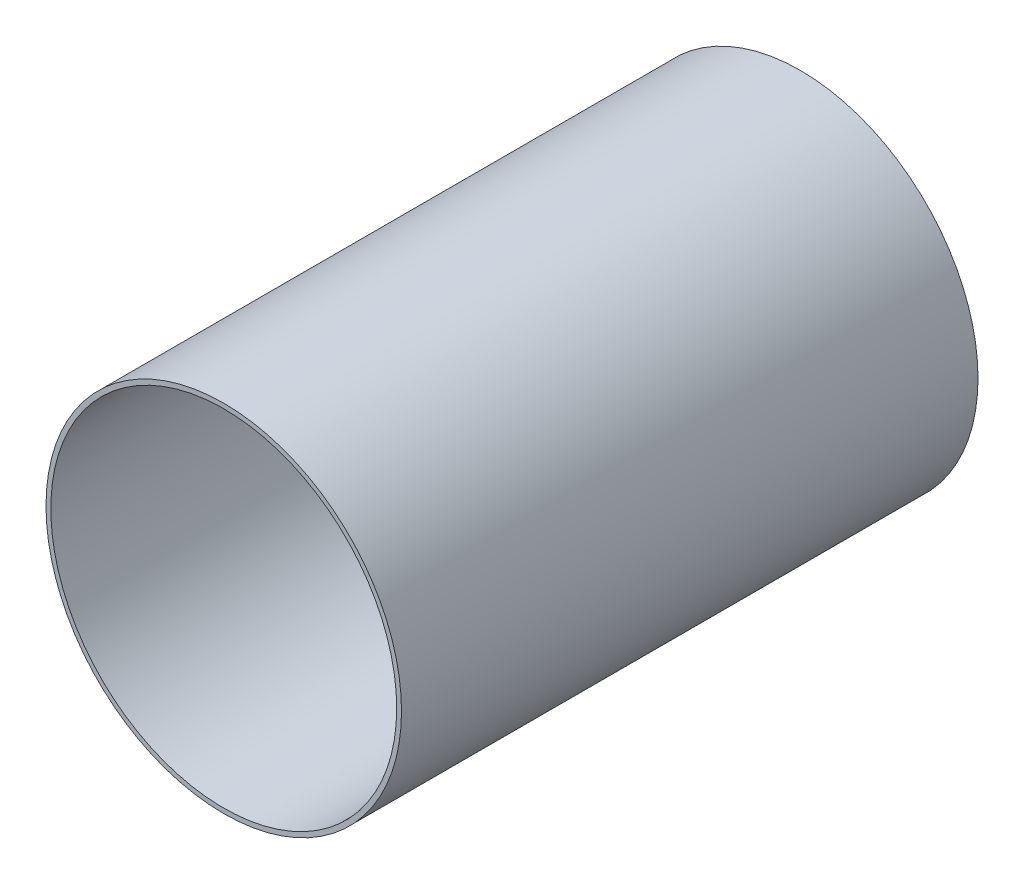
ISO-10303-21;
HEADER;
FILE_DESCRIPTION(('STEP AP214'),'2;1');
FILE_NAME('part.step','',(''),(''),'','','');
FILE_SCHEMA(('AUTOMOTIVE_DESIGN { 1 0 10303 214 1 1 1 1 }'));
ENDSEC;
DATA;
#1=APPLICATION_CONTEXT('core data for automotive mechanical design processes');
#2=APPLICATION_PROTOCOL_DEFINITION('international standard','automotive_design',2000,#1);
#3=PRODUCT_CONTEXT('',#1,'mechanical');
#4=PRODUCT('Part','Part','',(#3));
#5=PRODUCT_RELATED_PRODUCT_CATEGORY('part','',(#4));
#6=PRODUCT_DEFINITION_FORMATION('','',#4);
#7=PRODUCT_DEFINITION_CONTEXT('part definition',#1,'design');
#8=PRODUCT_DEFINITION('design','',#6,#7);
#9=PRODUCT_DEFINITION_SHAPE('','',#8);
#10=(LENGTH_UNIT() NAMED_UNIT(*) SI_UNIT(.MILLI.,.METRE.));
#11=(NAMED_UNIT(*) PLANE_ANGLE_UNIT() SI_UNIT($,.RADIAN.));
#12=(NAMED_UNIT(*) SI_UNIT($,.STERADIAN.) SOLID_ANGLE_UNIT());
#13=UNCERTAINTY_MEASURE_WITH_UNIT(LENGTH_MEASURE(1.E-05),#10,'distance_accuracy_value','');
#14=(GEOMETRIC_REPRESENTATION_CONTEXT(3) GLOBAL_UNCERTAINTY_ASSIGNED_CONTEXT((#13)) GLOBAL_UNIT_ASSIGNED_CONTEXT((#10,
#11,#12)) REPRESENTATION_CONTEXT('',''));
#15=CARTESIAN_POINT('',(0.,0.,0.));
#16=DIRECTION('',(0.,0.,1.));
#17=DIRECTION('',(1.,0.,0.));
#18=AXIS2_PLACEMENT_3D('',#15,#16,#17);
#19=CARTESIAN_POINT('',(0.,0.,300.));
#20=DIRECTION('',(0.,0.,1.));
#21=DIRECTION('',(1.,0.,0.));
#22=AXIS2_PLACEMENT_3D('',#19,#20,#21);
#23=PLANE('',#22);
#24=CARTESIAN_POINT('',(0.,0.,300.));
#25=DIRECTION('',(0.,0.,1.));
#26=DIRECTION('',(1.,0.,0.));
#27=AXIS2_PLACEMENT_3D('',#24,#25,#26);
#28=CIRCLE('',#27,92.5);
#29=CARTESIAN_POINT('',(92.5,0.,300.));
#30=VERTEX_POINT('',#29);
#31=EDGE_CURVE('E10',#30,#30,#28,.T.);
#32=ORIENTED_EDGE('',*,*,#31,.T.);
#33=EDGE_LOOP('',(#32));
#34=FACE_BOUND('',#33,.T.);
#35=CARTESIAN_POINT('',(0.,0.,300.));
#36=DIRECTION('',(0.,0.,1.));
#37=DIRECTION('',(1.,0.,0.));
#38=AXIS2_PLACEMENT_3D('',#35,#36,#37);
#39=CIRCLE('',#38,90.);
#40=CARTESIAN_POINT('',(90.,0.,300.));
#41=VERTEX_POINT('',#40);
#42=EDGE_CURVE('E44',#41,#41,#39,.T.);
#43=ORIENTED_EDGE('',*,*,#42,.F.);
#44=EDGE_LOOP('',(#43));
#45=FACE_BOUND('',#44,.T.);
#46=ADVANCED_FACE('F33',(#34,#45),#23,.T.);
#47=CARTESIAN_POINT('',(0.,0.,0.));
#48=DIRECTION('',(0.,0.,1.));
#49=DIRECTION('',(1.,0.,0.));
#50=AXIS2_PLACEMENT_3D('',#47,#48,#49);
#51=PLANE('',#50);
#52=CARTESIAN_POINT('',(0.,0.,0.));
#53=DIRECTION('',(0.,0.,1.));
#54=DIRECTION('',(1.,0.,0.));
#55=AXIS2_PLACEMENT_3D('',#52,#53,#54);
#56=CIRCLE('',#55,92.5);
#57=CARTESIAN_POINT('',(92.5,0.,0.));
#58=VERTEX_POINT('',#57);
#59=EDGE_CURVE('E37',#58,#58,#56,.T.);
#60=ORIENTED_EDGE('',*,*,#59,.F.);
#61=EDGE_LOOP('',(#60));
#62=FACE_BOUND('',#61,.T.);
#63=CARTESIAN_POINT('',(0.,0.,0.));
#64=DIRECTION('',(0.,0.,1.));
#65=DIRECTION('',(1.,0.,0.));
#66=AXIS2_PLACEMENT_3D('',#63,#64,#65);
#67=CIRCLE('',#66,90.);
#68=CARTESIAN_POINT('',(90.,0.,0.));
#69=VERTEX_POINT('',#68);
#70=EDGE_CURVE('E46',#69,#69,#67,.T.);
#71=ORIENTED_EDGE('',*,*,#70,.T.);
#72=EDGE_LOOP('',(#71));
#73=FACE_BOUND('',#72,.T.);
#74=ADVANCED_FACE('F56',(#62,#73),#51,.F.);
#75=CARTESIAN_POINT('',(0.,0.,300.));
#76=DIRECTION('',(0.,0.,-1.));
#77=DIRECTION('',(-1.,0.,0.));
#78=AXIS2_PLACEMENT_3D('',#75,#76,#77);
#79=CYLINDRICAL_SURFACE('',#78,92.5);
#80=ORIENTED_EDGE('',*,*,#31,.F.);
#81=EDGE_LOOP('',(#80));
#82=FACE_BOUND('',#81,.T.);
#83=ORIENTED_EDGE('',*,*,#59,.T.);
#84=EDGE_LOOP('',(#83));
#85=FACE_BOUND('',#84,.T.);
#86=ADVANCED_FACE('F35',(#82,#85),#79,.T.);
#87=CARTESIAN_POINT('',(0.,0.,300.));
#88=DIRECTION('',(0.,0.,-1.));
#89=DIRECTION('',(-1.,0.,0.));
#90=AXIS2_PLACEMENT_3D('',#87,#88,#89);
#91=CYLINDRICAL_SURFACE('',#90,90.);
#92=ORIENTED_EDGE('',*,*,#42,.T.);
#93=EDGE_LOOP('',(#92));
#94=FACE_BOUND('',#93,.T.);
#95=ORIENTED_EDGE('',*,*,#70,.F.);
#96=EDGE_LOOP('',(#95));
#97=FACE_BOUND('',#96,.T.);
#98=ADVANCED_FACE('F52',(#94,#97),#91,.F.);
#99=CLOSED_SHELL('',(#46,#74,#86,#98));
#100=MANIFOLD_SOLID_BREP('B2',#99);
#101=ADVANCED_BREP_SHAPE_REPRESENTATION('',(#18,#100),#14);
#102=SHAPE_DEFINITION_REPRESENTATION(#9,#101);
ENDSEC;
END-ISO-10303-21;
